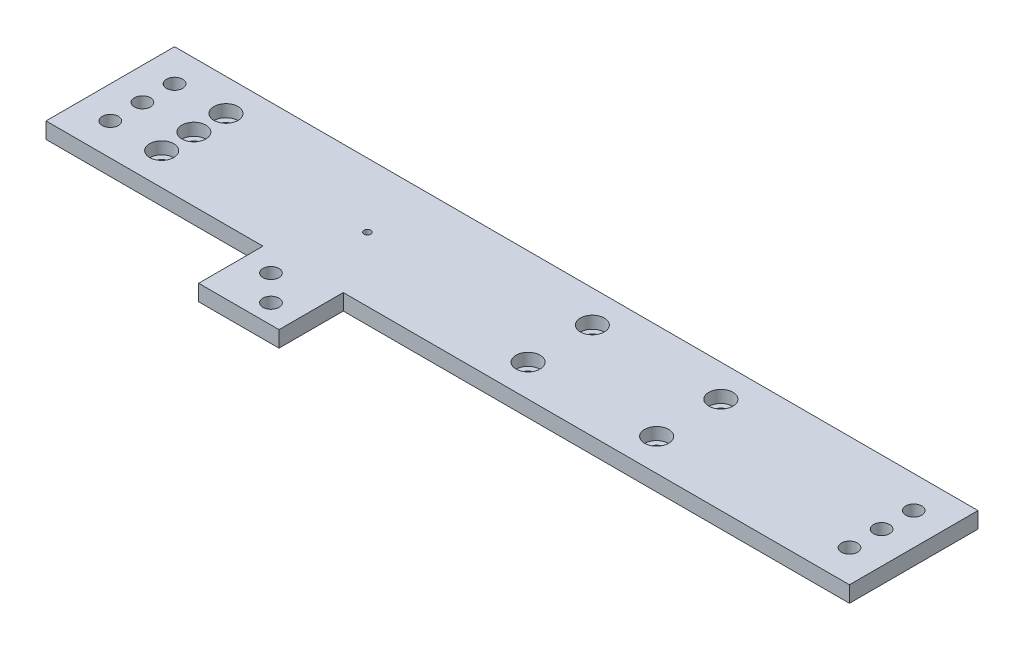
ISO-10303-21;
HEADER;
FILE_DESCRIPTION(('STEP AP214'),'2;1');
FILE_NAME('part.step','',(''),(''),'','','');
FILE_SCHEMA(('AUTOMOTIVE_DESIGN { 1 0 10303 214 1 1 1 1 }'));
ENDSEC;
DATA;
#1=APPLICATION_CONTEXT('core data for automotive mechanical design processes');
#2=APPLICATION_PROTOCOL_DEFINITION('international standard','automotive_design',2000,#1);
#3=PRODUCT_CONTEXT('',#1,'mechanical');
#4=PRODUCT('Part','Part','',(#3));
#5=PRODUCT_RELATED_PRODUCT_CATEGORY('part','',(#4));
#6=PRODUCT_DEFINITION_FORMATION('','',#4);
#7=PRODUCT_DEFINITION_CONTEXT('part definition',#1,'design');
#8=PRODUCT_DEFINITION('design','',#6,#7);
#9=PRODUCT_DEFINITION_SHAPE('','',#8);
#10=(LENGTH_UNIT() NAMED_UNIT(*) SI_UNIT(.MILLI.,.METRE.));
#11=(NAMED_UNIT(*) PLANE_ANGLE_UNIT() SI_UNIT($,.RADIAN.));
#12=(NAMED_UNIT(*) SI_UNIT($,.STERADIAN.) SOLID_ANGLE_UNIT());
#13=UNCERTAINTY_MEASURE_WITH_UNIT(LENGTH_MEASURE(1.E-05),#10,'distance_accuracy_value','');
#14=(GEOMETRIC_REPRESENTATION_CONTEXT(3) GLOBAL_UNCERTAINTY_ASSIGNED_CONTEXT((#13)) GLOBAL_UNIT_ASSIGNED_CONTEXT((#10,
#11,#12)) REPRESENTATION_CONTEXT('',''));
#15=CARTESIAN_POINT('',(0.,0.,0.));
#16=DIRECTION('',(0.,0.,1.));
#17=DIRECTION('',(1.,0.,0.));
#18=AXIS2_PLACEMENT_3D('',#15,#16,#17);
#19=CARTESIAN_POINT('',(-158.75,6.35,25.4));
#20=DIRECTION('',(0.,0.,-1.));
#21=DIRECTION('',(-1.,0.,0.));
#22=AXIS2_PLACEMENT_3D('',#19,#20,#21);
#23=PLANE('',#22);
#24=DIRECTION('',(0.,1.,0.));
#25=VECTOR('',#24,1.);
#26=CARTESIAN_POINT('',(-41.275,-40.6598389076986,25.4));
#27=LINE('',#26,#25);
#28=CARTESIAN_POINT('',(-41.275,0.,25.4));
#29=VERTEX_POINT('',#28);
#30=CARTESIAN_POINT('',(-41.275,6.35,25.4));
#31=VERTEX_POINT('',#30);
#32=EDGE_CURVE('E135',#29,#31,#27,.T.);
#33=ORIENTED_EDGE('',*,*,#32,.F.);
#34=DIRECTION('',(1.,0.,0.));
#35=VECTOR('',#34,1.);
#36=CARTESIAN_POINT('',(-158.75,0.,25.4));
#37=LINE('',#36,#35);
#38=CARTESIAN_POINT('',(158.75,0.,25.4));
#39=VERTEX_POINT('',#38);
#40=EDGE_CURVE('E99',#29,#39,#37,.T.);
#41=ORIENTED_EDGE('',*,*,#40,.T.);
#42=DIRECTION('',(0.,-1.,0.));
#43=VECTOR('',#42,1.);
#44=CARTESIAN_POINT('',(158.75,6.35,25.4));
#45=LINE('',#44,#43);
#46=CARTESIAN_POINT('',(158.75,6.35,25.4));
#47=VERTEX_POINT('',#46);
#48=EDGE_CURVE('E296',#47,#39,#45,.T.);
#49=ORIENTED_EDGE('',*,*,#48,.F.);
#50=DIRECTION('',(1.,0.,0.));
#51=VECTOR('',#50,1.);
#52=CARTESIAN_POINT('',(-158.75,6.35,25.4));
#53=LINE('',#52,#51);
#54=EDGE_CURVE('E77',#31,#47,#53,.T.);
#55=ORIENTED_EDGE('',*,*,#54,.F.);
#56=EDGE_LOOP('',(#33,#41,#49,#55));
#57=FACE_BOUND('',#56,.T.);
#58=ADVANCED_FACE('F53',(#57),#23,.F.);
#59=CARTESIAN_POINT('',(158.75,6.35,25.4));
#60=DIRECTION('',(-1.,0.,0.));
#61=DIRECTION('',(0.,0.,1.));
#62=AXIS2_PLACEMENT_3D('',#59,#60,#61);
#63=PLANE('',#62);
#64=DIRECTION('',(0.,0.,-1.));
#65=VECTOR('',#64,1.);
#66=CARTESIAN_POINT('',(158.75,0.,25.4));
#67=LINE('',#66,#65);
#68=CARTESIAN_POINT('',(158.75,0.,-25.4));
#69=VERTEX_POINT('',#68);
#70=EDGE_CURVE('E286',#39,#69,#67,.T.);
#71=ORIENTED_EDGE('',*,*,#70,.T.);
#72=DIRECTION('',(0.,-1.,0.));
#73=VECTOR('',#72,1.);
#74=CARTESIAN_POINT('',(158.75,6.35,-25.4));
#75=LINE('',#74,#73);
#76=CARTESIAN_POINT('',(158.75,6.35,-25.4));
#77=VERTEX_POINT('',#76);
#78=EDGE_CURVE('E11',#77,#69,#75,.T.);
#79=ORIENTED_EDGE('',*,*,#78,.F.);
#80=DIRECTION('',(0.,0.,-1.));
#81=VECTOR('',#80,1.);
#82=CARTESIAN_POINT('',(158.75,6.35,25.4));
#83=LINE('',#82,#81);
#84=EDGE_CURVE('E287',#47,#77,#83,.T.);
#85=ORIENTED_EDGE('',*,*,#84,.F.);
#86=ORIENTED_EDGE('',*,*,#48,.T.);
#87=EDGE_LOOP('',(#71,#79,#85,#86));
#88=FACE_BOUND('',#87,.T.);
#89=ADVANCED_FACE('F55',(#88),#63,.F.);
#90=CARTESIAN_POINT('',(-158.75,6.35,-25.4));
#91=DIRECTION('',(0.,0.,1.));
#92=DIRECTION('',(1.,0.,0.));
#93=AXIS2_PLACEMENT_3D('',#90,#91,#92);
#94=PLANE('',#93);
#95=DIRECTION('',(-1.,0.,0.));
#96=VECTOR('',#95,1.);
#97=CARTESIAN_POINT('',(-158.75,0.,-25.4));
#98=LINE('',#97,#96);
#99=CARTESIAN_POINT('',(-158.75,0.,-25.4));
#100=VERTEX_POINT('',#99);
#101=EDGE_CURVE('E299',#69,#100,#98,.T.);
#102=ORIENTED_EDGE('',*,*,#101,.T.);
#103=DIRECTION('',(0.,-1.,0.));
#104=VECTOR('',#103,1.);
#105=CARTESIAN_POINT('',(-158.75,6.35,-25.4));
#106=LINE('',#105,#104);
#107=CARTESIAN_POINT('',(-158.75,6.35,-25.4));
#108=VERTEX_POINT('',#107);
#109=EDGE_CURVE('E61',#108,#100,#106,.T.);
#110=ORIENTED_EDGE('',*,*,#109,.F.);
#111=DIRECTION('',(-1.,0.,0.));
#112=VECTOR('',#111,1.);
#113=CARTESIAN_POINT('',(-158.75,6.35,-25.4));
#114=LINE('',#113,#112);
#115=EDGE_CURVE('E106',#77,#108,#114,.T.);
#116=ORIENTED_EDGE('',*,*,#115,.F.);
#117=ORIENTED_EDGE('',*,*,#78,.T.);
#118=EDGE_LOOP('',(#102,#110,#116,#117));
#119=FACE_BOUND('',#118,.T.);
#120=ADVANCED_FACE('F322',(#119),#94,.F.);
#121=CARTESIAN_POINT('',(-158.75,6.35,25.4));
#122=DIRECTION('',(1.,0.,0.));
#123=DIRECTION('',(0.,0.,-1.));
#124=AXIS2_PLACEMENT_3D('',#121,#122,#123);
#125=PLANE('',#124);
#126=DIRECTION('',(0.,0.,1.));
#127=VECTOR('',#126,1.);
#128=CARTESIAN_POINT('',(-158.75,0.,25.4));
#129=LINE('',#128,#127);
#130=CARTESIAN_POINT('',(-158.75,0.,25.4));
#131=VERTEX_POINT('',#130);
#132=EDGE_CURVE('E301',#100,#131,#129,.T.);
#133=ORIENTED_EDGE('',*,*,#132,.T.);
#134=DIRECTION('',(0.,-1.,0.));
#135=VECTOR('',#134,1.);
#136=CARTESIAN_POINT('',(-158.75,6.35,25.4));
#137=LINE('',#136,#135);
#138=CARTESIAN_POINT('',(-158.75,6.35,25.4));
#139=VERTEX_POINT('',#138);
#140=EDGE_CURVE('E306',#139,#131,#137,.T.);
#141=ORIENTED_EDGE('',*,*,#140,.F.);
#142=DIRECTION('',(0.,0.,1.));
#143=VECTOR('',#142,1.);
#144=CARTESIAN_POINT('',(-158.75,6.35,25.4));
#145=LINE('',#144,#143);
#146=EDGE_CURVE('E291',#108,#139,#145,.T.);
#147=ORIENTED_EDGE('',*,*,#146,.F.);
#148=ORIENTED_EDGE('',*,*,#109,.T.);
#149=EDGE_LOOP('',(#133,#141,#147,#148));
#150=FACE_BOUND('',#149,.T.);
#151=ADVANCED_FACE('F312',(#150),#125,.F.);
#152=CARTESIAN_POINT('',(-73.025,0.,25.4));
#153=VERTEX_POINT('',#152);
#154=EDGE_CURVE('E289',#131,#153,#37,.T.);
#155=ORIENTED_EDGE('',*,*,#154,.T.);
#156=DIRECTION('',(0.,1.,0.));
#157=VECTOR('',#156,1.);
#158=CARTESIAN_POINT('',(-73.025,-40.6598389076986,25.4));
#159=LINE('',#158,#157);
#160=CARTESIAN_POINT('',(-73.0250000000001,6.35,25.4));
#161=VERTEX_POINT('',#160);
#162=EDGE_CURVE('E155',#153,#161,#159,.T.);
#163=ORIENTED_EDGE('',*,*,#162,.T.);
#164=EDGE_CURVE('E293',#139,#161,#53,.T.);
#165=ORIENTED_EDGE('',*,*,#164,.F.);
#166=ORIENTED_EDGE('',*,*,#140,.T.);
#167=EDGE_LOOP('',(#155,#163,#165,#166));
#168=FACE_BOUND('',#167,.T.);
#169=ADVANCED_FACE('F316',(#168),#23,.F.);
#170=CARTESIAN_POINT('',(0.,6.35,0.));
#171=DIRECTION('',(0.,-1.,0.));
#172=DIRECTION('',(0.,0.,-1.));
#173=AXIS2_PLACEMENT_3D('',#170,#171,#172);
#174=PLANE('',#173);
#175=CARTESIAN_POINT('',(-52.07,6.35,43.18));
#176=DIRECTION('',(0.,-1.,0.));
#177=DIRECTION('',(0.,0.,-1.));
#178=AXIS2_PLACEMENT_3D('',#175,#176,#177);
#179=CIRCLE('',#178,3.175);
#180=CARTESIAN_POINT('',(-52.07,6.35,40.005));
#181=VERTEX_POINT('',#180);
#182=EDGE_CURVE('E478',#181,#181,#179,.T.);
#183=ORIENTED_EDGE('',*,*,#182,.T.);
#184=EDGE_LOOP('',(#183));
#185=FACE_BOUND('',#184,.T.);
#186=CARTESIAN_POINT('',(-62.23,6.35,33.02));
#187=DIRECTION('',(0.,-1.,0.));
#188=DIRECTION('',(0.,0.,-1.));
#189=AXIS2_PLACEMENT_3D('',#186,#187,#188);
#190=CIRCLE('',#189,3.175);
#191=CARTESIAN_POINT('',(-62.23,6.35,29.845));
#192=VERTEX_POINT('',#191);
#193=EDGE_CURVE('E488',#192,#192,#190,.T.);
#194=ORIENTED_EDGE('',*,*,#193,.T.);
#195=EDGE_LOOP('',(#194));
#196=FACE_BOUND('',#195,.T.);
#197=CARTESIAN_POINT('',(-57.15,6.35,0.));
#198=DIRECTION('',(0.,-1.,0.));
#199=DIRECTION('',(0.,0.,-1.));
#200=AXIS2_PLACEMENT_3D('',#197,#198,#199);
#201=CIRCLE('',#200,1.35255);
#202=CARTESIAN_POINT('',(-57.15,6.35,-1.35255));
#203=VERTEX_POINT('',#202);
#204=EDGE_CURVE('E163',#203,#203,#201,.T.);
#205=ORIENTED_EDGE('',*,*,#204,.T.);
#206=EDGE_LOOP('',(#205));
#207=FACE_BOUND('',#206,.T.);
#208=CARTESIAN_POINT('',(-146.05,6.35,12.7));
#209=DIRECTION('',(0.,-1.,0.));
#210=DIRECTION('',(0.,0.,-1.));
#211=AXIS2_PLACEMENT_3D('',#208,#209,#210);
#212=CIRCLE('',#211,3.17500000000001);
#213=CARTESIAN_POINT('',(-146.05,6.35,9.52499999999999));
#214=VERTEX_POINT('',#213);
#215=EDGE_CURVE('E169',#214,#214,#212,.T.);
#216=ORIENTED_EDGE('',*,*,#215,.T.);
#217=EDGE_LOOP('',(#216));
#218=FACE_BOUND('',#217,.T.);
#219=CARTESIAN_POINT('',(-146.05,6.35,0.));
#220=DIRECTION('',(0.,-1.,0.));
#221=DIRECTION('',(0.,0.,-1.));
#222=AXIS2_PLACEMENT_3D('',#219,#220,#221);
#223=CIRCLE('',#222,3.17500000000001);
#224=CARTESIAN_POINT('',(-146.05,6.35,-3.17500000000001));
#225=VERTEX_POINT('',#224);
#226=EDGE_CURVE('E175',#225,#225,#223,.T.);
#227=ORIENTED_EDGE('',*,*,#226,.T.);
#228=EDGE_LOOP('',(#227));
#229=FACE_BOUND('',#228,.T.);
#230=CARTESIAN_POINT('',(-146.05,6.35,-12.7));
#231=DIRECTION('',(0.,-1.,0.));
#232=DIRECTION('',(0.,0.,-1.));
#233=AXIS2_PLACEMENT_3D('',#230,#231,#232);
#234=CIRCLE('',#233,3.17500000000001);
#235=CARTESIAN_POINT('',(-146.05,6.35,-15.875));
#236=VERTEX_POINT('',#235);
#237=EDGE_CURVE('E181',#236,#236,#234,.T.);
#238=ORIENTED_EDGE('',*,*,#237,.T.);
#239=EDGE_LOOP('',(#238));
#240=FACE_BOUND('',#239,.T.);
#241=CARTESIAN_POINT('',(146.05,6.35,12.7));
#242=DIRECTION('',(0.,-1.,0.));
#243=DIRECTION('',(0.,0.,-1.));
#244=AXIS2_PLACEMENT_3D('',#241,#242,#243);
#245=CIRCLE('',#244,3.17500000000001);
#246=CARTESIAN_POINT('',(146.05,6.35,9.52499999999998));
#247=VERTEX_POINT('',#246);
#248=EDGE_CURVE('E187',#247,#247,#245,.T.);
#249=ORIENTED_EDGE('',*,*,#248,.T.);
#250=EDGE_LOOP('',(#249));
#251=FACE_BOUND('',#250,.T.);
#252=CARTESIAN_POINT('',(146.05,6.35,0.));
#253=DIRECTION('',(0.,-1.,0.));
#254=DIRECTION('',(0.,0.,-1.));
#255=AXIS2_PLACEMENT_3D('',#252,#253,#254);
#256=CIRCLE('',#255,3.17500000000001);
#257=CARTESIAN_POINT('',(146.05,6.35,-3.17500000000001));
#258=VERTEX_POINT('',#257);
#259=EDGE_CURVE('E193',#258,#258,#256,.T.);
#260=ORIENTED_EDGE('',*,*,#259,.T.);
#261=EDGE_LOOP('',(#260));
#262=FACE_BOUND('',#261,.T.);
#263=CARTESIAN_POINT('',(146.05,6.35,-12.7));
#264=DIRECTION('',(0.,-1.,0.));
#265=DIRECTION('',(0.,0.,-1.));
#266=AXIS2_PLACEMENT_3D('',#263,#264,#265);
#267=CIRCLE('',#266,3.17500000000001);
#268=CARTESIAN_POINT('',(146.05,6.35,-15.875));
#269=VERTEX_POINT('',#268);
#270=EDGE_CURVE('E199',#269,#269,#267,.T.);
#271=ORIENTED_EDGE('',*,*,#270,.T.);
#272=EDGE_LOOP('',(#271));
#273=FACE_BOUND('',#272,.T.);
#274=CARTESIAN_POINT('',(19.05,6.35,-12.7));
#275=DIRECTION('',(0.,1.,0.));
#276=DIRECTION('',(0.,0.,1.));
#277=AXIS2_PLACEMENT_3D('',#274,#275,#276);
#278=CIRCLE('',#277,4.76249999999999);
#279=CARTESIAN_POINT('',(19.05,6.35,-7.93750000000001));
#280=VERTEX_POINT('',#279);
#281=EDGE_CURVE('E202',#280,#280,#278,.T.);
#282=ORIENTED_EDGE('',*,*,#281,.F.);
#283=EDGE_LOOP('',(#282));
#284=FACE_BOUND('',#283,.T.);
#285=CARTESIAN_POINT('',(69.85,6.35,-12.7));
#286=DIRECTION('',(0.,1.,0.));
#287=DIRECTION('',(0.,0.,1.));
#288=AXIS2_PLACEMENT_3D('',#285,#286,#287);
#289=CIRCLE('',#288,4.76249999999999);
#290=CARTESIAN_POINT('',(69.85,6.35,-7.93750000000001));
#291=VERTEX_POINT('',#290);
#292=EDGE_CURVE('E214',#291,#291,#289,.T.);
#293=ORIENTED_EDGE('',*,*,#292,.F.);
#294=EDGE_LOOP('',(#293));
#295=FACE_BOUND('',#294,.T.);
#296=CARTESIAN_POINT('',(19.05,6.35,12.7));
#297=DIRECTION('',(0.,1.,0.));
#298=DIRECTION('',(0.,0.,1.));
#299=AXIS2_PLACEMENT_3D('',#296,#297,#298);
#300=CIRCLE('',#299,4.76249999999999);
#301=CARTESIAN_POINT('',(19.05,6.35,17.4625));
#302=VERTEX_POINT('',#301);
#303=EDGE_CURVE('E226',#302,#302,#300,.T.);
#304=ORIENTED_EDGE('',*,*,#303,.F.);
#305=EDGE_LOOP('',(#304));
#306=FACE_BOUND('',#305,.T.);
#307=CARTESIAN_POINT('',(69.85,6.35,12.7));
#308=DIRECTION('',(0.,1.,0.));
#309=DIRECTION('',(0.,0.,1.));
#310=AXIS2_PLACEMENT_3D('',#307,#308,#309);
#311=CIRCLE('',#310,4.76249999999999);
#312=CARTESIAN_POINT('',(69.85,6.35,17.4625));
#313=VERTEX_POINT('',#312);
#314=EDGE_CURVE('E238',#313,#313,#311,.T.);
#315=ORIENTED_EDGE('',*,*,#314,.F.);
#316=EDGE_LOOP('',(#315));
#317=FACE_BOUND('',#316,.T.);
#318=CARTESIAN_POINT('',(-125.73,6.35,-12.7));
#319=DIRECTION('',(0.,1.,0.));
#320=DIRECTION('',(0.,0.,1.));
#321=AXIS2_PLACEMENT_3D('',#318,#319,#320);
#322=CIRCLE('',#321,4.76249999999999);
#323=CARTESIAN_POINT('',(-125.73,6.35,-7.93750000000001));
#324=VERTEX_POINT('',#323);
#325=EDGE_CURVE('E250',#324,#324,#322,.T.);
#326=ORIENTED_EDGE('',*,*,#325,.F.);
#327=EDGE_LOOP('',(#326));
#328=FACE_BOUND('',#327,.T.);
#329=CARTESIAN_POINT('',(-125.73,6.35,0.));
#330=DIRECTION('',(0.,1.,0.));
#331=DIRECTION('',(0.,0.,1.));
#332=AXIS2_PLACEMENT_3D('',#329,#330,#331);
#333=CIRCLE('',#332,4.76249999999999);
#334=CARTESIAN_POINT('',(-125.73,6.35,4.76249999999999));
#335=VERTEX_POINT('',#334);
#336=EDGE_CURVE('E262',#335,#335,#333,.T.);
#337=ORIENTED_EDGE('',*,*,#336,.F.);
#338=EDGE_LOOP('',(#337));
#339=FACE_BOUND('',#338,.T.);
#340=CARTESIAN_POINT('',(-125.73,6.35,12.7));
#341=DIRECTION('',(0.,1.,0.));
#342=DIRECTION('',(0.,0.,1.));
#343=AXIS2_PLACEMENT_3D('',#340,#341,#342);
#344=CIRCLE('',#343,4.76249999999999);
#345=CARTESIAN_POINT('',(-125.73,6.35,17.4625));
#346=VERTEX_POINT('',#345);
#347=EDGE_CURVE('E274',#346,#346,#344,.T.);
#348=ORIENTED_EDGE('',*,*,#347,.F.);
#349=EDGE_LOOP('',(#348));
#350=FACE_BOUND('',#349,.T.);
#351=ORIENTED_EDGE('',*,*,#84,.T.);
#352=ORIENTED_EDGE('',*,*,#115,.T.);
#353=ORIENTED_EDGE('',*,*,#146,.T.);
#354=ORIENTED_EDGE('',*,*,#164,.T.);
#355=DIRECTION('',(0.,0.,1.));
#356=VECTOR('',#355,1.);
#357=CARTESIAN_POINT('',(-73.025,6.35,25.4));
#358=LINE('',#357,#356);
#359=CARTESIAN_POINT('',(-73.025,6.35,50.8));
#360=VERTEX_POINT('',#359);
#361=EDGE_CURVE('E68',#161,#360,#358,.T.);
#362=ORIENTED_EDGE('',*,*,#361,.T.);
#363=DIRECTION('',(1.,0.,0.));
#364=VECTOR('',#363,1.);
#365=CARTESIAN_POINT('',(-73.025,6.35,50.8));
#366=LINE('',#365,#364);
#367=CARTESIAN_POINT('',(-41.275,6.35,50.8));
#368=VERTEX_POINT('',#367);
#369=EDGE_CURVE('E149',#360,#368,#366,.T.);
#370=ORIENTED_EDGE('',*,*,#369,.T.);
#371=DIRECTION('',(0.,0.,-1.));
#372=VECTOR('',#371,1.);
#373=CARTESIAN_POINT('',(-41.275,6.35,25.4));
#374=LINE('',#373,#372);
#375=EDGE_CURVE('E140',#368,#31,#374,.T.);
#376=ORIENTED_EDGE('',*,*,#375,.T.);
#377=ORIENTED_EDGE('',*,*,#54,.T.);
#378=EDGE_LOOP('',(#351,#352,#353,#354,#362,#370,#376,#377));
#379=FACE_BOUND('',#378,.T.);
#380=ADVANCED_FACE('F318',(#185,#196,#207,#218,#229,#240,#251,#262,#273,#284,#295,#306,#317,
#328,#339,#350,#379),#174,.F.);
#381=CARTESIAN_POINT('',(0.,0.,0.));
#382=DIRECTION('',(0.,-1.,0.));
#383=DIRECTION('',(0.,0.,-1.));
#384=AXIS2_PLACEMENT_3D('',#381,#382,#383);
#385=PLANE('',#384);
#386=CARTESIAN_POINT('',(-52.07,0.,43.18));
#387=DIRECTION('',(0.,-1.,0.));
#388=DIRECTION('',(0.,0.,-1.));
#389=AXIS2_PLACEMENT_3D('',#386,#387,#388);
#390=CIRCLE('',#389,3.17499999999998);
#391=CARTESIAN_POINT('',(-52.07,0.,40.005));
#392=VERTEX_POINT('',#391);
#393=EDGE_CURVE('E481',#392,#392,#390,.T.);
#394=ORIENTED_EDGE('',*,*,#393,.F.);
#395=EDGE_LOOP('',(#394));
#396=FACE_BOUND('',#395,.T.);
#397=CARTESIAN_POINT('',(-62.23,0.,33.02));
#398=DIRECTION('',(0.,-1.,0.));
#399=DIRECTION('',(0.,0.,-1.));
#400=AXIS2_PLACEMENT_3D('',#397,#398,#399);
#401=CIRCLE('',#400,3.17499999999998);
#402=CARTESIAN_POINT('',(-62.23,0.,29.845));
#403=VERTEX_POINT('',#402);
#404=EDGE_CURVE('E483',#403,#403,#401,.T.);
#405=ORIENTED_EDGE('',*,*,#404,.F.);
#406=EDGE_LOOP('',(#405));
#407=FACE_BOUND('',#406,.T.);
#408=CARTESIAN_POINT('',(-57.15,0.,0.));
#409=DIRECTION('',(0.,-1.,0.));
#410=DIRECTION('',(0.,0.,-1.));
#411=AXIS2_PLACEMENT_3D('',#408,#409,#410);
#412=CIRCLE('',#411,1.35255);
#413=CARTESIAN_POINT('',(-57.15,0.,-1.35255));
#414=VERTEX_POINT('',#413);
#415=EDGE_CURVE('E160',#414,#414,#412,.T.);
#416=ORIENTED_EDGE('',*,*,#415,.F.);
#417=EDGE_LOOP('',(#416));
#418=FACE_BOUND('',#417,.T.);
#419=CARTESIAN_POINT('',(-146.05,0.,12.7));
#420=DIRECTION('',(0.,-1.,0.));
#421=DIRECTION('',(0.,0.,-1.));
#422=AXIS2_PLACEMENT_3D('',#419,#420,#421);
#423=CIRCLE('',#422,3.17500000000001);
#424=CARTESIAN_POINT('',(-146.05,0.,9.52499999999999));
#425=VERTEX_POINT('',#424);
#426=EDGE_CURVE('E166',#425,#425,#423,.T.);
#427=ORIENTED_EDGE('',*,*,#426,.F.);
#428=EDGE_LOOP('',(#427));
#429=FACE_BOUND('',#428,.T.);
#430=CARTESIAN_POINT('',(-146.05,0.,0.));
#431=DIRECTION('',(0.,-1.,0.));
#432=DIRECTION('',(0.,0.,-1.));
#433=AXIS2_PLACEMENT_3D('',#430,#431,#432);
#434=CIRCLE('',#433,3.17500000000001);
#435=CARTESIAN_POINT('',(-146.05,0.,-3.17500000000001));
#436=VERTEX_POINT('',#435);
#437=EDGE_CURVE('E172',#436,#436,#434,.T.);
#438=ORIENTED_EDGE('',*,*,#437,.F.);
#439=EDGE_LOOP('',(#438));
#440=FACE_BOUND('',#439,.T.);
#441=CARTESIAN_POINT('',(-146.05,0.,-12.7));
#442=DIRECTION('',(0.,-1.,0.));
#443=DIRECTION('',(0.,0.,-1.));
#444=AXIS2_PLACEMENT_3D('',#441,#442,#443);
#445=CIRCLE('',#444,3.17500000000001);
#446=CARTESIAN_POINT('',(-146.05,0.,-15.875));
#447=VERTEX_POINT('',#446);
#448=EDGE_CURVE('E178',#447,#447,#445,.T.);
#449=ORIENTED_EDGE('',*,*,#448,.F.);
#450=EDGE_LOOP('',(#449));
#451=FACE_BOUND('',#450,.T.);
#452=CARTESIAN_POINT('',(146.05,0.,12.7));
#453=DIRECTION('',(0.,-1.,0.));
#454=DIRECTION('',(0.,0.,-1.));
#455=AXIS2_PLACEMENT_3D('',#452,#453,#454);
#456=CIRCLE('',#455,3.17500000000001);
#457=CARTESIAN_POINT('',(146.05,0.,9.52499999999998));
#458=VERTEX_POINT('',#457);
#459=EDGE_CURVE('E184',#458,#458,#456,.T.);
#460=ORIENTED_EDGE('',*,*,#459,.F.);
#461=EDGE_LOOP('',(#460));
#462=FACE_BOUND('',#461,.T.);
#463=CARTESIAN_POINT('',(146.05,0.,0.));
#464=DIRECTION('',(0.,-1.,0.));
#465=DIRECTION('',(0.,0.,-1.));
#466=AXIS2_PLACEMENT_3D('',#463,#464,#465);
#467=CIRCLE('',#466,3.17500000000001);
#468=CARTESIAN_POINT('',(146.05,0.,-3.17500000000001));
#469=VERTEX_POINT('',#468);
#470=EDGE_CURVE('E190',#469,#469,#467,.T.);
#471=ORIENTED_EDGE('',*,*,#470,.F.);
#472=EDGE_LOOP('',(#471));
#473=FACE_BOUND('',#472,.T.);
#474=CARTESIAN_POINT('',(146.05,0.,-12.7));
#475=DIRECTION('',(0.,-1.,0.));
#476=DIRECTION('',(0.,0.,-1.));
#477=AXIS2_PLACEMENT_3D('',#474,#475,#476);
#478=CIRCLE('',#477,3.17500000000001);
#479=CARTESIAN_POINT('',(146.05,0.,-15.875));
#480=VERTEX_POINT('',#479);
#481=EDGE_CURVE('E196',#480,#480,#478,.T.);
#482=ORIENTED_EDGE('',*,*,#481,.F.);
#483=EDGE_LOOP('',(#482));
#484=FACE_BOUND('',#483,.T.);
#485=CARTESIAN_POINT('',(19.05,0.,-12.7));
#486=DIRECTION('',(0.,1.,0.));
#487=DIRECTION('',(0.,0.,1.));
#488=AXIS2_PLACEMENT_3D('',#485,#486,#487);
#489=CIRCLE('',#488,2.55270000000001);
#490=CARTESIAN_POINT('',(19.05,0.,-10.1473));
#491=VERTEX_POINT('',#490);
#492=EDGE_CURVE('E211',#491,#491,#489,.T.);
#493=ORIENTED_EDGE('',*,*,#492,.T.);
#494=EDGE_LOOP('',(#493));
#495=FACE_BOUND('',#494,.T.);
#496=CARTESIAN_POINT('',(69.85,0.,-12.7));
#497=DIRECTION('',(0.,1.,0.));
#498=DIRECTION('',(0.,0.,1.));
#499=AXIS2_PLACEMENT_3D('',#496,#497,#498);
#500=CIRCLE('',#499,2.55270000000001);
#501=CARTESIAN_POINT('',(69.85,0.,-10.1473));
#502=VERTEX_POINT('',#501);
#503=EDGE_CURVE('E223',#502,#502,#500,.T.);
#504=ORIENTED_EDGE('',*,*,#503,.T.);
#505=EDGE_LOOP('',(#504));
#506=FACE_BOUND('',#505,.T.);
#507=CARTESIAN_POINT('',(19.05,0.,12.7));
#508=DIRECTION('',(0.,1.,0.));
#509=DIRECTION('',(0.,0.,1.));
#510=AXIS2_PLACEMENT_3D('',#507,#508,#509);
#511=CIRCLE('',#510,2.55270000000001);
#512=CARTESIAN_POINT('',(19.05,0.,15.2527));
#513=VERTEX_POINT('',#512);
#514=EDGE_CURVE('E235',#513,#513,#511,.T.);
#515=ORIENTED_EDGE('',*,*,#514,.T.);
#516=EDGE_LOOP('',(#515));
#517=FACE_BOUND('',#516,.T.);
#518=CARTESIAN_POINT('',(69.85,0.,12.7));
#519=DIRECTION('',(0.,1.,0.));
#520=DIRECTION('',(0.,0.,1.));
#521=AXIS2_PLACEMENT_3D('',#518,#519,#520);
#522=CIRCLE('',#521,2.55270000000001);
#523=CARTESIAN_POINT('',(69.85,0.,15.2527));
#524=VERTEX_POINT('',#523);
#525=EDGE_CURVE('E247',#524,#524,#522,.T.);
#526=ORIENTED_EDGE('',*,*,#525,.T.);
#527=EDGE_LOOP('',(#526));
#528=FACE_BOUND('',#527,.T.);
#529=CARTESIAN_POINT('',(-125.73,0.,-12.7));
#530=DIRECTION('',(0.,1.,0.));
#531=DIRECTION('',(0.,0.,1.));
#532=AXIS2_PLACEMENT_3D('',#529,#530,#531);
#533=CIRCLE('',#532,2.55270000000001);
#534=CARTESIAN_POINT('',(-125.73,0.,-10.1473));
#535=VERTEX_POINT('',#534);
#536=EDGE_CURVE('E259',#535,#535,#533,.T.);
#537=ORIENTED_EDGE('',*,*,#536,.T.);
#538=EDGE_LOOP('',(#537));
#539=FACE_BOUND('',#538,.T.);
#540=CARTESIAN_POINT('',(-125.73,0.,0.));
#541=DIRECTION('',(0.,1.,0.));
#542=DIRECTION('',(0.,0.,1.));
#543=AXIS2_PLACEMENT_3D('',#540,#541,#542);
#544=CIRCLE('',#543,2.55270000000001);
#545=CARTESIAN_POINT('',(-125.73,0.,2.55270000000001));
#546=VERTEX_POINT('',#545);
#547=EDGE_CURVE('E271',#546,#546,#544,.T.);
#548=ORIENTED_EDGE('',*,*,#547,.T.);
#549=EDGE_LOOP('',(#548));
#550=FACE_BOUND('',#549,.T.);
#551=CARTESIAN_POINT('',(-125.73,0.,12.7));
#552=DIRECTION('',(0.,1.,0.));
#553=DIRECTION('',(0.,0.,1.));
#554=AXIS2_PLACEMENT_3D('',#551,#552,#553);
#555=CIRCLE('',#554,2.55270000000001);
#556=CARTESIAN_POINT('',(-125.73,0.,15.2527));
#557=VERTEX_POINT('',#556);
#558=EDGE_CURVE('E283',#557,#557,#555,.T.);
#559=ORIENTED_EDGE('',*,*,#558,.T.);
#560=EDGE_LOOP('',(#559));
#561=FACE_BOUND('',#560,.T.);
#562=ORIENTED_EDGE('',*,*,#70,.F.);
#563=ORIENTED_EDGE('',*,*,#40,.F.);
#564=DIRECTION('',(0.,0.,-1.));
#565=VECTOR('',#564,1.);
#566=CARTESIAN_POINT('',(-41.275,0.,25.4));
#567=LINE('',#566,#565);
#568=CARTESIAN_POINT('',(-41.275,0.,50.8));
#569=VERTEX_POINT('',#568);
#570=EDGE_CURVE('E127',#569,#29,#567,.T.);
#571=ORIENTED_EDGE('',*,*,#570,.F.);
#572=DIRECTION('',(1.,0.,0.));
#573=VECTOR('',#572,1.);
#574=CARTESIAN_POINT('',(-73.025,0.,50.8));
#575=LINE('',#574,#573);
#576=CARTESIAN_POINT('',(-73.025,0.,50.8));
#577=VERTEX_POINT('',#576);
#578=EDGE_CURVE('E132',#577,#569,#575,.T.);
#579=ORIENTED_EDGE('',*,*,#578,.F.);
#580=DIRECTION('',(0.,0.,1.));
#581=VECTOR('',#580,1.);
#582=CARTESIAN_POINT('',(-73.025,0.,25.4));
#583=LINE('',#582,#581);
#584=EDGE_CURVE('E154',#153,#577,#583,.T.);
#585=ORIENTED_EDGE('',*,*,#584,.F.);
#586=ORIENTED_EDGE('',*,*,#154,.F.);
#587=ORIENTED_EDGE('',*,*,#132,.F.);
#588=ORIENTED_EDGE('',*,*,#101,.F.);
#589=EDGE_LOOP('',(#562,#563,#571,#579,#585,#586,#587,#588));
#590=FACE_BOUND('',#589,.T.);
#591=ADVANCED_FACE('F130',(#396,#407,#418,#429,#440,#451,#462,#473,#484,#495,#506,#517,#528,
#539,#550,#561,#590),#385,.T.);
#592=CARTESIAN_POINT('',(-125.73,6.35,12.7));
#593=DIRECTION('',(0.,1.,0.));
#594=DIRECTION('',(0.,0.,1.));
#595=AXIS2_PLACEMENT_3D('',#592,#593,#594);
#596=CYLINDRICAL_SURFACE('',#595,2.55270000000001);
#597=ORIENTED_EDGE('',*,*,#558,.F.);
#598=EDGE_LOOP('',(#597));
#599=FACE_BOUND('',#598,.T.);
#600=CARTESIAN_POINT('',(-125.73,1.524,12.7));
#601=DIRECTION('',(0.,1.,0.));
#602=DIRECTION('',(0.,0.,1.));
#603=AXIS2_PLACEMENT_3D('',#600,#601,#602);
#604=CIRCLE('',#603,2.55270000000001);
#605=CARTESIAN_POINT('',(-125.73,1.524,15.2527));
#606=VERTEX_POINT('',#605);
#607=EDGE_CURVE('E280',#606,#606,#604,.T.);
#608=ORIENTED_EDGE('',*,*,#607,.T.);
#609=EDGE_LOOP('',(#608));
#610=FACE_BOUND('',#609,.T.);
#611=ADVANCED_FACE('F346',(#599,#610),#596,.F.);
#612=CARTESIAN_POINT('',(-123.1773,1.524,12.7));
#613=DIRECTION('',(0.,-1.,0.));
#614=DIRECTION('',(0.,0.,-1.));
#615=AXIS2_PLACEMENT_3D('',#612,#613,#614);
#616=PLANE('',#615);
#617=ORIENTED_EDGE('',*,*,#607,.F.);
#618=EDGE_LOOP('',(#617));
#619=FACE_BOUND('',#618,.T.);
#620=CARTESIAN_POINT('',(-125.73,1.524,12.7));
#621=DIRECTION('',(0.,1.,0.));
#622=DIRECTION('',(0.,0.,1.));
#623=AXIS2_PLACEMENT_3D('',#620,#621,#622);
#624=CIRCLE('',#623,4.7625);
#625=CARTESIAN_POINT('',(-125.73,1.524,17.4625));
#626=VERTEX_POINT('',#625);
#627=EDGE_CURVE('E277',#626,#626,#624,.T.);
#628=ORIENTED_EDGE('',*,*,#627,.T.);
#629=EDGE_LOOP('',(#628));
#630=FACE_BOUND('',#629,.T.);
#631=ADVANCED_FACE('F353',(#619,#630),#616,.F.);
#632=CARTESIAN_POINT('',(-125.73,6.35,12.7));
#633=DIRECTION('',(0.,1.,0.));
#634=DIRECTION('',(0.,0.,1.));
#635=AXIS2_PLACEMENT_3D('',#632,#633,#634);
#636=CYLINDRICAL_SURFACE('',#635,4.7625);
#637=ORIENTED_EDGE('',*,*,#627,.F.);
#638=EDGE_LOOP('',(#637));
#639=FACE_BOUND('',#638,.T.);
#640=ORIENTED_EDGE('',*,*,#347,.T.);
#641=EDGE_LOOP('',(#640));
#642=FACE_BOUND('',#641,.T.);
#643=ADVANCED_FACE('F357',(#639,#642),#636,.F.);
#644=CARTESIAN_POINT('',(-125.73,6.35,0.));
#645=DIRECTION('',(0.,1.,0.));
#646=DIRECTION('',(0.,0.,1.));
#647=AXIS2_PLACEMENT_3D('',#644,#645,#646);
#648=CYLINDRICAL_SURFACE('',#647,2.55270000000001);
#649=ORIENTED_EDGE('',*,*,#547,.F.);
#650=EDGE_LOOP('',(#649));
#651=FACE_BOUND('',#650,.T.);
#652=CARTESIAN_POINT('',(-125.73,1.524,0.));
#653=DIRECTION('',(0.,1.,0.));
#654=DIRECTION('',(0.,0.,1.));
#655=AXIS2_PLACEMENT_3D('',#652,#653,#654);
#656=CIRCLE('',#655,2.55270000000001);
#657=CARTESIAN_POINT('',(-125.73,1.524,2.55270000000001));
#658=VERTEX_POINT('',#657);
#659=EDGE_CURVE('E268',#658,#658,#656,.T.);
#660=ORIENTED_EDGE('',*,*,#659,.T.);
#661=EDGE_LOOP('',(#660));
#662=FACE_BOUND('',#661,.T.);
#663=ADVANCED_FACE('F361',(#651,#662),#648,.F.);
#664=CARTESIAN_POINT('',(-123.1773,1.524,0.));
#665=DIRECTION('',(0.,-1.,0.));
#666=DIRECTION('',(0.,0.,-1.));
#667=AXIS2_PLACEMENT_3D('',#664,#665,#666);
#668=PLANE('',#667);
#669=ORIENTED_EDGE('',*,*,#659,.F.);
#670=EDGE_LOOP('',(#669));
#671=FACE_BOUND('',#670,.T.);
#672=CARTESIAN_POINT('',(-125.73,1.524,0.));
#673=DIRECTION('',(0.,1.,0.));
#674=DIRECTION('',(0.,0.,1.));
#675=AXIS2_PLACEMENT_3D('',#672,#673,#674);
#676=CIRCLE('',#675,4.7625);
#677=CARTESIAN_POINT('',(-125.73,1.524,4.7625));
#678=VERTEX_POINT('',#677);
#679=EDGE_CURVE('E265',#678,#678,#676,.T.);
#680=ORIENTED_EDGE('',*,*,#679,.T.);
#681=EDGE_LOOP('',(#680));
#682=FACE_BOUND('',#681,.T.);
#683=ADVANCED_FACE('F365',(#671,#682),#668,.F.);
#684=CARTESIAN_POINT('',(-125.73,6.35,0.));
#685=DIRECTION('',(0.,1.,0.));
#686=DIRECTION('',(0.,0.,1.));
#687=AXIS2_PLACEMENT_3D('',#684,#685,#686);
#688=CYLINDRICAL_SURFACE('',#687,4.7625);
#689=ORIENTED_EDGE('',*,*,#679,.F.);
#690=EDGE_LOOP('',(#689));
#691=FACE_BOUND('',#690,.T.);
#692=ORIENTED_EDGE('',*,*,#336,.T.);
#693=EDGE_LOOP('',(#692));
#694=FACE_BOUND('',#693,.T.);
#695=ADVANCED_FACE('F369',(#691,#694),#688,.F.);
#696=CARTESIAN_POINT('',(-125.73,6.35,-12.7));
#697=DIRECTION('',(0.,1.,0.));
#698=DIRECTION('',(0.,0.,1.));
#699=AXIS2_PLACEMENT_3D('',#696,#697,#698);
#700=CYLINDRICAL_SURFACE('',#699,2.55270000000001);
#701=ORIENTED_EDGE('',*,*,#536,.F.);
#702=EDGE_LOOP('',(#701));
#703=FACE_BOUND('',#702,.T.);
#704=CARTESIAN_POINT('',(-125.73,1.524,-12.7));
#705=DIRECTION('',(0.,1.,0.));
#706=DIRECTION('',(0.,0.,1.));
#707=AXIS2_PLACEMENT_3D('',#704,#705,#706);
#708=CIRCLE('',#707,2.55270000000001);
#709=CARTESIAN_POINT('',(-125.73,1.524,-10.1473));
#710=VERTEX_POINT('',#709);
#711=EDGE_CURVE('E256',#710,#710,#708,.T.);
#712=ORIENTED_EDGE('',*,*,#711,.T.);
#713=EDGE_LOOP('',(#712));
#714=FACE_BOUND('',#713,.T.);
#715=ADVANCED_FACE('F373',(#703,#714),#700,.F.);
#716=CARTESIAN_POINT('',(-123.1773,1.524,-12.7));
#717=DIRECTION('',(0.,-1.,0.));
#718=DIRECTION('',(0.,0.,-1.));
#719=AXIS2_PLACEMENT_3D('',#716,#717,#718);
#720=PLANE('',#719);
#721=ORIENTED_EDGE('',*,*,#711,.F.);
#722=EDGE_LOOP('',(#721));
#723=FACE_BOUND('',#722,.T.);
#724=CARTESIAN_POINT('',(-125.73,1.524,-12.7));
#725=DIRECTION('',(0.,1.,0.));
#726=DIRECTION('',(0.,0.,1.));
#727=AXIS2_PLACEMENT_3D('',#724,#725,#726);
#728=CIRCLE('',#727,4.7625);
#729=CARTESIAN_POINT('',(-125.73,1.524,-7.9375));
#730=VERTEX_POINT('',#729);
#731=EDGE_CURVE('E253',#730,#730,#728,.T.);
#732=ORIENTED_EDGE('',*,*,#731,.T.);
#733=EDGE_LOOP('',(#732));
#734=FACE_BOUND('',#733,.T.);
#735=ADVANCED_FACE('F377',(#723,#734),#720,.F.);
#736=CARTESIAN_POINT('',(-125.73,6.35,-12.7));
#737=DIRECTION('',(0.,1.,0.));
#738=DIRECTION('',(0.,0.,1.));
#739=AXIS2_PLACEMENT_3D('',#736,#737,#738);
#740=CYLINDRICAL_SURFACE('',#739,4.7625);
#741=ORIENTED_EDGE('',*,*,#731,.F.);
#742=EDGE_LOOP('',(#741));
#743=FACE_BOUND('',#742,.T.);
#744=ORIENTED_EDGE('',*,*,#325,.T.);
#745=EDGE_LOOP('',(#744));
#746=FACE_BOUND('',#745,.T.);
#747=ADVANCED_FACE('F381',(#743,#746),#740,.F.);
#748=CARTESIAN_POINT('',(69.85,6.35,12.7));
#749=DIRECTION('',(0.,1.,0.));
#750=DIRECTION('',(0.,0.,1.));
#751=AXIS2_PLACEMENT_3D('',#748,#749,#750);
#752=CYLINDRICAL_SURFACE('',#751,2.55270000000001);
#753=ORIENTED_EDGE('',*,*,#525,.F.);
#754=EDGE_LOOP('',(#753));
#755=FACE_BOUND('',#754,.T.);
#756=CARTESIAN_POINT('',(69.85,1.524,12.7));
#757=DIRECTION('',(0.,1.,0.));
#758=DIRECTION('',(0.,0.,1.));
#759=AXIS2_PLACEMENT_3D('',#756,#757,#758);
#760=CIRCLE('',#759,2.55270000000001);
#761=CARTESIAN_POINT('',(69.85,1.524,15.2527));
#762=VERTEX_POINT('',#761);
#763=EDGE_CURVE('E244',#762,#762,#760,.T.);
#764=ORIENTED_EDGE('',*,*,#763,.T.);
#765=EDGE_LOOP('',(#764));
#766=FACE_BOUND('',#765,.T.);
#767=ADVANCED_FACE('F385',(#755,#766),#752,.F.);
#768=CARTESIAN_POINT('',(72.4027,1.524,12.7));
#769=DIRECTION('',(0.,-1.,0.));
#770=DIRECTION('',(0.,0.,-1.));
#771=AXIS2_PLACEMENT_3D('',#768,#769,#770);
#772=PLANE('',#771);
#773=ORIENTED_EDGE('',*,*,#763,.F.);
#774=EDGE_LOOP('',(#773));
#775=FACE_BOUND('',#774,.T.);
#776=CARTESIAN_POINT('',(69.85,1.524,12.7));
#777=DIRECTION('',(0.,1.,0.));
#778=DIRECTION('',(0.,0.,1.));
#779=AXIS2_PLACEMENT_3D('',#776,#777,#778);
#780=CIRCLE('',#779,4.7625);
#781=CARTESIAN_POINT('',(69.85,1.524,17.4625));
#782=VERTEX_POINT('',#781);
#783=EDGE_CURVE('E241',#782,#782,#780,.T.);
#784=ORIENTED_EDGE('',*,*,#783,.T.);
#785=EDGE_LOOP('',(#784));
#786=FACE_BOUND('',#785,.T.);
#787=ADVANCED_FACE('F389',(#775,#786),#772,.F.);
#788=CARTESIAN_POINT('',(69.85,6.35,12.7));
#789=DIRECTION('',(0.,1.,0.));
#790=DIRECTION('',(0.,0.,1.));
#791=AXIS2_PLACEMENT_3D('',#788,#789,#790);
#792=CYLINDRICAL_SURFACE('',#791,4.7625);
#793=ORIENTED_EDGE('',*,*,#783,.F.);
#794=EDGE_LOOP('',(#793));
#795=FACE_BOUND('',#794,.T.);
#796=ORIENTED_EDGE('',*,*,#314,.T.);
#797=EDGE_LOOP('',(#796));
#798=FACE_BOUND('',#797,.T.);
#799=ADVANCED_FACE('F393',(#795,#798),#792,.F.);
#800=CARTESIAN_POINT('',(19.05,6.35,12.7));
#801=DIRECTION('',(0.,1.,0.));
#802=DIRECTION('',(0.,0.,1.));
#803=AXIS2_PLACEMENT_3D('',#800,#801,#802);
#804=CYLINDRICAL_SURFACE('',#803,2.55270000000001);
#805=ORIENTED_EDGE('',*,*,#514,.F.);
#806=EDGE_LOOP('',(#805));
#807=FACE_BOUND('',#806,.T.);
#808=CARTESIAN_POINT('',(19.05,1.524,12.7));
#809=DIRECTION('',(0.,1.,0.));
#810=DIRECTION('',(0.,0.,1.));
#811=AXIS2_PLACEMENT_3D('',#808,#809,#810);
#812=CIRCLE('',#811,2.5527);
#813=CARTESIAN_POINT('',(19.05,1.524,15.2527));
#814=VERTEX_POINT('',#813);
#815=EDGE_CURVE('E232',#814,#814,#812,.T.);
#816=ORIENTED_EDGE('',*,*,#815,.T.);
#817=EDGE_LOOP('',(#816));
#818=FACE_BOUND('',#817,.T.);
#819=ADVANCED_FACE('F397',(#807,#818),#804,.F.);
#820=CARTESIAN_POINT('',(21.6027,1.524,12.7));
#821=DIRECTION('',(0.,-1.,0.));
#822=DIRECTION('',(0.,0.,-1.));
#823=AXIS2_PLACEMENT_3D('',#820,#821,#822);
#824=PLANE('',#823);
#825=ORIENTED_EDGE('',*,*,#815,.F.);
#826=EDGE_LOOP('',(#825));
#827=FACE_BOUND('',#826,.T.);
#828=CARTESIAN_POINT('',(19.05,1.524,12.7));
#829=DIRECTION('',(0.,1.,0.));
#830=DIRECTION('',(0.,0.,1.));
#831=AXIS2_PLACEMENT_3D('',#828,#829,#830);
#832=CIRCLE('',#831,4.7625);
#833=CARTESIAN_POINT('',(19.05,1.524,17.4625));
#834=VERTEX_POINT('',#833);
#835=EDGE_CURVE('E229',#834,#834,#832,.T.);
#836=ORIENTED_EDGE('',*,*,#835,.T.);
#837=EDGE_LOOP('',(#836));
#838=FACE_BOUND('',#837,.T.);
#839=ADVANCED_FACE('F401',(#827,#838),#824,.F.);
#840=CARTESIAN_POINT('',(19.05,6.35,12.7));
#841=DIRECTION('',(0.,1.,0.));
#842=DIRECTION('',(0.,0.,1.));
#843=AXIS2_PLACEMENT_3D('',#840,#841,#842);
#844=CYLINDRICAL_SURFACE('',#843,4.76249999999999);
#845=ORIENTED_EDGE('',*,*,#835,.F.);
#846=EDGE_LOOP('',(#845));
#847=FACE_BOUND('',#846,.T.);
#848=ORIENTED_EDGE('',*,*,#303,.T.);
#849=EDGE_LOOP('',(#848));
#850=FACE_BOUND('',#849,.T.);
#851=ADVANCED_FACE('F405',(#847,#850),#844,.F.);
#852=CARTESIAN_POINT('',(69.85,6.35,-12.7));
#853=DIRECTION('',(0.,1.,0.));
#854=DIRECTION('',(0.,0.,1.));
#855=AXIS2_PLACEMENT_3D('',#852,#853,#854);
#856=CYLINDRICAL_SURFACE('',#855,2.55270000000001);
#857=ORIENTED_EDGE('',*,*,#503,.F.);
#858=EDGE_LOOP('',(#857));
#859=FACE_BOUND('',#858,.T.);
#860=CARTESIAN_POINT('',(69.85,1.524,-12.7));
#861=DIRECTION('',(0.,1.,0.));
#862=DIRECTION('',(0.,0.,1.));
#863=AXIS2_PLACEMENT_3D('',#860,#861,#862);
#864=CIRCLE('',#863,2.55270000000001);
#865=CARTESIAN_POINT('',(69.85,1.524,-10.1473));
#866=VERTEX_POINT('',#865);
#867=EDGE_CURVE('E220',#866,#866,#864,.T.);
#868=ORIENTED_EDGE('',*,*,#867,.T.);
#869=EDGE_LOOP('',(#868));
#870=FACE_BOUND('',#869,.T.);
#871=ADVANCED_FACE('F409',(#859,#870),#856,.F.);
#872=CARTESIAN_POINT('',(72.4027,1.524,-12.7));
#873=DIRECTION('',(0.,-1.,0.));
#874=DIRECTION('',(0.,0.,-1.));
#875=AXIS2_PLACEMENT_3D('',#872,#873,#874);
#876=PLANE('',#875);
#877=ORIENTED_EDGE('',*,*,#867,.F.);
#878=EDGE_LOOP('',(#877));
#879=FACE_BOUND('',#878,.T.);
#880=CARTESIAN_POINT('',(69.85,1.524,-12.7));
#881=DIRECTION('',(0.,1.,0.));
#882=DIRECTION('',(0.,0.,1.));
#883=AXIS2_PLACEMENT_3D('',#880,#881,#882);
#884=CIRCLE('',#883,4.7625);
#885=CARTESIAN_POINT('',(69.85,1.524,-7.9375));
#886=VERTEX_POINT('',#885);
#887=EDGE_CURVE('E217',#886,#886,#884,.T.);
#888=ORIENTED_EDGE('',*,*,#887,.T.);
#889=EDGE_LOOP('',(#888));
#890=FACE_BOUND('',#889,.T.);
#891=ADVANCED_FACE('F413',(#879,#890),#876,.F.);
#892=CARTESIAN_POINT('',(69.85,6.35,-12.7));
#893=DIRECTION('',(0.,1.,0.));
#894=DIRECTION('',(0.,0.,1.));
#895=AXIS2_PLACEMENT_3D('',#892,#893,#894);
#896=CYLINDRICAL_SURFACE('',#895,4.7625);
#897=ORIENTED_EDGE('',*,*,#887,.F.);
#898=EDGE_LOOP('',(#897));
#899=FACE_BOUND('',#898,.T.);
#900=ORIENTED_EDGE('',*,*,#292,.T.);
#901=EDGE_LOOP('',(#900));
#902=FACE_BOUND('',#901,.T.);
#903=ADVANCED_FACE('F417',(#899,#902),#896,.F.);
#904=CARTESIAN_POINT('',(19.05,6.35,-12.7));
#905=DIRECTION('',(0.,1.,0.));
#906=DIRECTION('',(0.,0.,1.));
#907=AXIS2_PLACEMENT_3D('',#904,#905,#906);
#908=CYLINDRICAL_SURFACE('',#907,2.55270000000001);
#909=ORIENTED_EDGE('',*,*,#492,.F.);
#910=EDGE_LOOP('',(#909));
#911=FACE_BOUND('',#910,.T.);
#912=CARTESIAN_POINT('',(19.05,1.524,-12.7));
#913=DIRECTION('',(0.,1.,0.));
#914=DIRECTION('',(0.,0.,1.));
#915=AXIS2_PLACEMENT_3D('',#912,#913,#914);
#916=CIRCLE('',#915,2.5527);
#917=CARTESIAN_POINT('',(19.05,1.524,-10.1473));
#918=VERTEX_POINT('',#917);
#919=EDGE_CURVE('E208',#918,#918,#916,.T.);
#920=ORIENTED_EDGE('',*,*,#919,.T.);
#921=EDGE_LOOP('',(#920));
#922=FACE_BOUND('',#921,.T.);
#923=ADVANCED_FACE('F421',(#911,#922),#908,.F.);
#924=CARTESIAN_POINT('',(21.6027,1.524,-12.7));
#925=DIRECTION('',(0.,-1.,0.));
#926=DIRECTION('',(0.,0.,-1.));
#927=AXIS2_PLACEMENT_3D('',#924,#925,#926);
#928=PLANE('',#927);
#929=ORIENTED_EDGE('',*,*,#919,.F.);
#930=EDGE_LOOP('',(#929));
#931=FACE_BOUND('',#930,.T.);
#932=CARTESIAN_POINT('',(19.05,1.524,-12.7));
#933=DIRECTION('',(0.,1.,0.));
#934=DIRECTION('',(0.,0.,1.));
#935=AXIS2_PLACEMENT_3D('',#932,#933,#934);
#936=CIRCLE('',#935,4.7625);
#937=CARTESIAN_POINT('',(19.05,1.524,-7.93750000000001));
#938=VERTEX_POINT('',#937);
#939=EDGE_CURVE('E205',#938,#938,#936,.T.);
#940=ORIENTED_EDGE('',*,*,#939,.T.);
#941=EDGE_LOOP('',(#940));
#942=FACE_BOUND('',#941,.T.);
#943=ADVANCED_FACE('F425',(#931,#942),#928,.F.);
#944=CARTESIAN_POINT('',(19.05,6.35,-12.7));
#945=DIRECTION('',(0.,1.,0.));
#946=DIRECTION('',(0.,0.,1.));
#947=AXIS2_PLACEMENT_3D('',#944,#945,#946);
#948=CYLINDRICAL_SURFACE('',#947,4.76249999999999);
#949=ORIENTED_EDGE('',*,*,#939,.F.);
#950=EDGE_LOOP('',(#949));
#951=FACE_BOUND('',#950,.T.);
#952=ORIENTED_EDGE('',*,*,#281,.T.);
#953=EDGE_LOOP('',(#952));
#954=FACE_BOUND('',#953,.T.);
#955=ADVANCED_FACE('F429',(#951,#954),#948,.F.);
#956=CARTESIAN_POINT('',(146.05,0.,-12.7));
#957=DIRECTION('',(0.,-1.,0.));
#958=DIRECTION('',(0.,0.,-1.));
#959=AXIS2_PLACEMENT_3D('',#956,#957,#958);
#960=CYLINDRICAL_SURFACE('',#959,3.17500000000001);
#961=ORIENTED_EDGE('',*,*,#270,.F.);
#962=EDGE_LOOP('',(#961));
#963=FACE_BOUND('',#962,.T.);
#964=ORIENTED_EDGE('',*,*,#481,.T.);
#965=EDGE_LOOP('',(#964));
#966=FACE_BOUND('',#965,.T.);
#967=ADVANCED_FACE('F433',(#963,#966),#960,.F.);
#968=CARTESIAN_POINT('',(146.05,0.,0.));
#969=DIRECTION('',(0.,-1.,0.));
#970=DIRECTION('',(0.,0.,-1.));
#971=AXIS2_PLACEMENT_3D('',#968,#969,#970);
#972=CYLINDRICAL_SURFACE('',#971,3.17500000000001);
#973=ORIENTED_EDGE('',*,*,#259,.F.);
#974=EDGE_LOOP('',(#973));
#975=FACE_BOUND('',#974,.T.);
#976=ORIENTED_EDGE('',*,*,#470,.T.);
#977=EDGE_LOOP('',(#976));
#978=FACE_BOUND('',#977,.T.);
#979=ADVANCED_FACE('F437',(#975,#978),#972,.F.);
#980=CARTESIAN_POINT('',(146.05,0.,12.7));
#981=DIRECTION('',(0.,-1.,0.));
#982=DIRECTION('',(0.,0.,-1.));
#983=AXIS2_PLACEMENT_3D('',#980,#981,#982);
#984=CYLINDRICAL_SURFACE('',#983,3.17500000000001);
#985=ORIENTED_EDGE('',*,*,#248,.F.);
#986=EDGE_LOOP('',(#985));
#987=FACE_BOUND('',#986,.T.);
#988=ORIENTED_EDGE('',*,*,#459,.T.);
#989=EDGE_LOOP('',(#988));
#990=FACE_BOUND('',#989,.T.);
#991=ADVANCED_FACE('F441',(#987,#990),#984,.F.);
#992=CARTESIAN_POINT('',(-146.05,0.,-12.7));
#993=DIRECTION('',(0.,-1.,0.));
#994=DIRECTION('',(0.,0.,-1.));
#995=AXIS2_PLACEMENT_3D('',#992,#993,#994);
#996=CYLINDRICAL_SURFACE('',#995,3.17500000000001);
#997=ORIENTED_EDGE('',*,*,#237,.F.);
#998=EDGE_LOOP('',(#997));
#999=FACE_BOUND('',#998,.T.);
#1000=ORIENTED_EDGE('',*,*,#448,.T.);
#1001=EDGE_LOOP('',(#1000));
#1002=FACE_BOUND('',#1001,.T.);
#1003=ADVANCED_FACE('F445',(#999,#1002),#996,.F.);
#1004=CARTESIAN_POINT('',(-146.05,0.,0.));
#1005=DIRECTION('',(0.,-1.,0.));
#1006=DIRECTION('',(0.,0.,-1.));
#1007=AXIS2_PLACEMENT_3D('',#1004,#1005,#1006);
#1008=CYLINDRICAL_SURFACE('',#1007,3.17500000000001);
#1009=ORIENTED_EDGE('',*,*,#226,.F.);
#1010=EDGE_LOOP('',(#1009));
#1011=FACE_BOUND('',#1010,.T.);
#1012=ORIENTED_EDGE('',*,*,#437,.T.);
#1013=EDGE_LOOP('',(#1012));
#1014=FACE_BOUND('',#1013,.T.);
#1015=ADVANCED_FACE('F449',(#1011,#1014),#1008,.F.);
#1016=CARTESIAN_POINT('',(-146.05,0.,12.7));
#1017=DIRECTION('',(0.,-1.,0.));
#1018=DIRECTION('',(0.,0.,-1.));
#1019=AXIS2_PLACEMENT_3D('',#1016,#1017,#1018);
#1020=CYLINDRICAL_SURFACE('',#1019,3.17500000000001);
#1021=ORIENTED_EDGE('',*,*,#215,.F.);
#1022=EDGE_LOOP('',(#1021));
#1023=FACE_BOUND('',#1022,.T.);
#1024=ORIENTED_EDGE('',*,*,#426,.T.);
#1025=EDGE_LOOP('',(#1024));
#1026=FACE_BOUND('',#1025,.T.);
#1027=ADVANCED_FACE('F453',(#1023,#1026),#1020,.F.);
#1028=CARTESIAN_POINT('',(-57.15,0.,0.));
#1029=DIRECTION('',(0.,-1.,0.));
#1030=DIRECTION('',(0.,0.,-1.));
#1031=AXIS2_PLACEMENT_3D('',#1028,#1029,#1030);
#1032=CYLINDRICAL_SURFACE('',#1031,1.35255);
#1033=ORIENTED_EDGE('',*,*,#204,.F.);
#1034=EDGE_LOOP('',(#1033));
#1035=FACE_BOUND('',#1034,.T.);
#1036=ORIENTED_EDGE('',*,*,#415,.T.);
#1037=EDGE_LOOP('',(#1036));
#1038=FACE_BOUND('',#1037,.T.);
#1039=ADVANCED_FACE('F457',(#1035,#1038),#1032,.F.);
#1040=CARTESIAN_POINT('',(-73.025,-40.6598389076986,50.8));
#1041=DIRECTION('',(0.,0.,1.));
#1042=DIRECTION('',(1.,0.,0.));
#1043=AXIS2_PLACEMENT_3D('',#1040,#1041,#1042);
#1044=PLANE('',#1043);
#1045=DIRECTION('',(0.,1.,0.));
#1046=VECTOR('',#1045,1.);
#1047=CARTESIAN_POINT('',(-73.025,-40.6598389076986,50.8));
#1048=LINE('',#1047,#1046);
#1049=EDGE_CURVE('E147',#577,#360,#1048,.T.);
#1050=ORIENTED_EDGE('',*,*,#1049,.F.);
#1051=ORIENTED_EDGE('',*,*,#578,.T.);
#1052=DIRECTION('',(0.,1.,0.));
#1053=VECTOR('',#1052,1.);
#1054=CARTESIAN_POINT('',(-41.275,-40.6598389076986,50.8));
#1055=LINE('',#1054,#1053);
#1056=EDGE_CURVE('E136',#569,#368,#1055,.T.);
#1057=ORIENTED_EDGE('',*,*,#1056,.T.);
#1058=ORIENTED_EDGE('',*,*,#369,.F.);
#1059=EDGE_LOOP('',(#1050,#1051,#1057,#1058));
#1060=FACE_BOUND('',#1059,.T.);
#1061=ADVANCED_FACE('F146',(#1060),#1044,.T.);
#1062=CARTESIAN_POINT('',(-41.275,-40.6598389076986,25.4));
#1063=DIRECTION('',(1.,0.,0.));
#1064=DIRECTION('',(0.,0.,-1.));
#1065=AXIS2_PLACEMENT_3D('',#1062,#1063,#1064);
#1066=PLANE('',#1065);
#1067=ORIENTED_EDGE('',*,*,#1056,.F.);
#1068=ORIENTED_EDGE('',*,*,#570,.T.);
#1069=ORIENTED_EDGE('',*,*,#32,.T.);
#1070=ORIENTED_EDGE('',*,*,#375,.F.);
#1071=EDGE_LOOP('',(#1067,#1068,#1069,#1070));
#1072=FACE_BOUND('',#1071,.T.);
#1073=ADVANCED_FACE('F139',(#1072),#1066,.T.);
#1074=CARTESIAN_POINT('',(-73.025,-40.6598389076986,25.4));
#1075=DIRECTION('',(-1.,0.,0.));
#1076=DIRECTION('',(0.,0.,1.));
#1077=AXIS2_PLACEMENT_3D('',#1074,#1075,#1076);
#1078=PLANE('',#1077);
#1079=ORIENTED_EDGE('',*,*,#162,.F.);
#1080=ORIENTED_EDGE('',*,*,#584,.T.);
#1081=ORIENTED_EDGE('',*,*,#1049,.T.);
#1082=ORIENTED_EDGE('',*,*,#361,.F.);
#1083=EDGE_LOOP('',(#1079,#1080,#1081,#1082));
#1084=FACE_BOUND('',#1083,.T.);
#1085=ADVANCED_FACE('F465',(#1084),#1078,.T.);
#1086=CARTESIAN_POINT('',(-62.23,0.,33.02));
#1087=DIRECTION('',(0.,-1.,0.));
#1088=DIRECTION('',(0.,0.,-1.));
#1089=AXIS2_PLACEMENT_3D('',#1086,#1087,#1088);
#1090=CYLINDRICAL_SURFACE('',#1089,3.17499999999999);
#1091=ORIENTED_EDGE('',*,*,#193,.F.);
#1092=EDGE_LOOP('',(#1091));
#1093=FACE_BOUND('',#1092,.T.);
#1094=ORIENTED_EDGE('',*,*,#404,.T.);
#1095=EDGE_LOOP('',(#1094));
#1096=FACE_BOUND('',#1095,.T.);
#1097=ADVANCED_FACE('F467',(#1093,#1096),#1090,.F.);
#1098=CARTESIAN_POINT('',(-52.07,0.,43.18));
#1099=DIRECTION('',(0.,-1.,0.));
#1100=DIRECTION('',(0.,0.,-1.));
#1101=AXIS2_PLACEMENT_3D('',#1098,#1099,#1100);
#1102=CYLINDRICAL_SURFACE('',#1101,3.17499999999999);
#1103=ORIENTED_EDGE('',*,*,#182,.F.);
#1104=EDGE_LOOP('',(#1103));
#1105=FACE_BOUND('',#1104,.T.);
#1106=ORIENTED_EDGE('',*,*,#393,.T.);
#1107=EDGE_LOOP('',(#1106));
#1108=FACE_BOUND('',#1107,.T.);
#1109=ADVANCED_FACE('F470',(#1105,#1108),#1102,.F.);
#1110=CLOSED_SHELL('',(#58,#89,#120,#151,#169,#380,#591,#611,#631,#643,#663,#683,#695,#715,#735,
#747,#767,#787,#799,#819,#839,#851,#871,#891,#903,#923,#943,#955,#967,#979,#991,#1003,#1015,
#1027,#1039,#1061,#1073,#1085,#1097,#1109));
#1111=MANIFOLD_SOLID_BREP('B2',#1110);
#1112=ADVANCED_BREP_SHAPE_REPRESENTATION('',(#18,#1111),#14);
#1113=SHAPE_DEFINITION_REPRESENTATION(#9,#1112);
ENDSEC;
END-ISO-10303-21;
